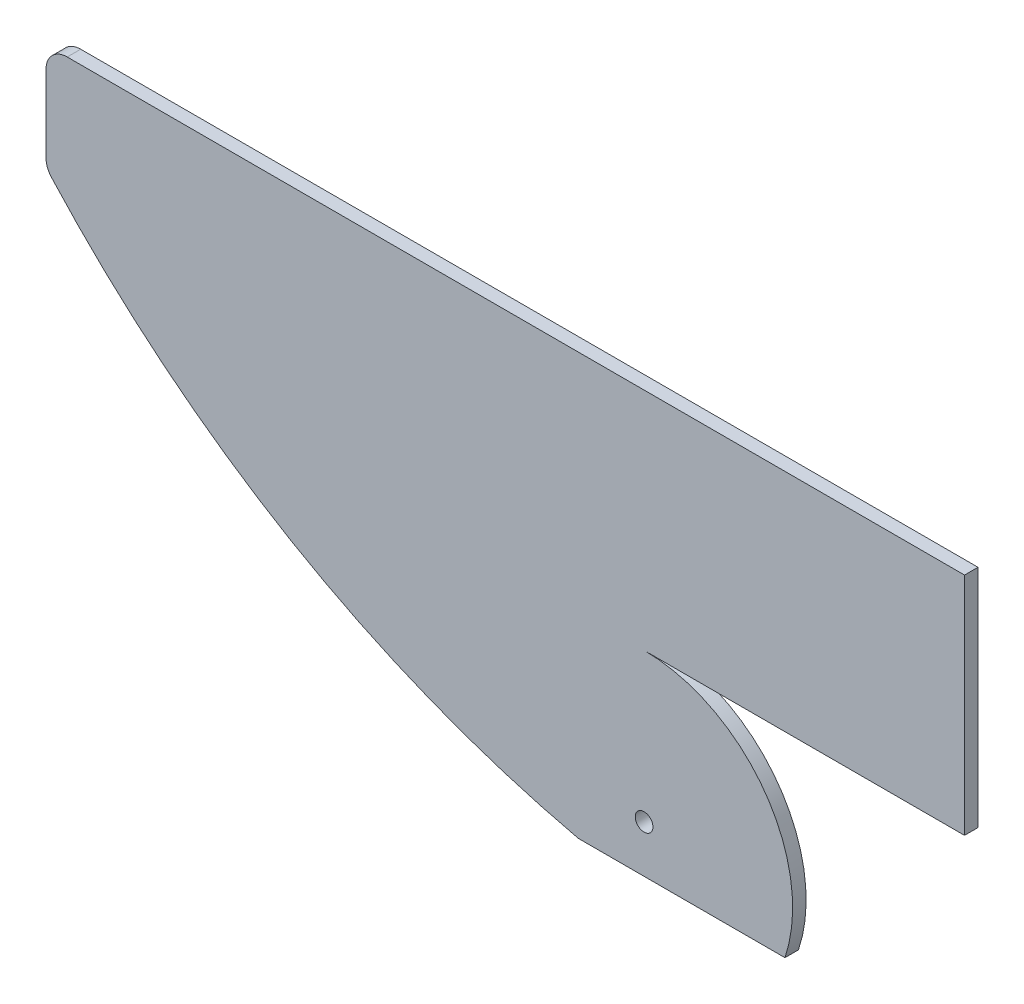
ISO-10303-21;
HEADER;
FILE_DESCRIPTION(('STEP AP214'),'2;1');
FILE_NAME('part.step','',(''),(''),'','','');
FILE_SCHEMA(('AUTOMOTIVE_DESIGN { 1 0 10303 214 1 1 1 1 }'));
ENDSEC;
DATA;
#1=APPLICATION_CONTEXT('core data for automotive mechanical design processes');
#2=APPLICATION_PROTOCOL_DEFINITION('international standard','automotive_design',2000,#1);
#3=PRODUCT_CONTEXT('',#1,'mechanical');
#4=PRODUCT('Part','Part','',(#3));
#5=PRODUCT_RELATED_PRODUCT_CATEGORY('part','',(#4));
#6=PRODUCT_DEFINITION_FORMATION('','',#4);
#7=PRODUCT_DEFINITION_CONTEXT('part definition',#1,'design');
#8=PRODUCT_DEFINITION('design','',#6,#7);
#9=PRODUCT_DEFINITION_SHAPE('','',#8);
#10=(LENGTH_UNIT() NAMED_UNIT(*) SI_UNIT(.MILLI.,.METRE.));
#11=(NAMED_UNIT(*) PLANE_ANGLE_UNIT() SI_UNIT($,.RADIAN.));
#12=(NAMED_UNIT(*) SI_UNIT($,.STERADIAN.) SOLID_ANGLE_UNIT());
#13=UNCERTAINTY_MEASURE_WITH_UNIT(LENGTH_MEASURE(1.E-05),#10,'distance_accuracy_value','');
#14=(GEOMETRIC_REPRESENTATION_CONTEXT(3) GLOBAL_UNCERTAINTY_ASSIGNED_CONTEXT((#13)) GLOBAL_UNIT_ASSIGNED_CONTEXT((#10,
#11,#12)) REPRESENTATION_CONTEXT('',''));
#15=CARTESIAN_POINT('',(0.,0.,0.));
#16=DIRECTION('',(0.,0.,1.));
#17=DIRECTION('',(1.,0.,0.));
#18=AXIS2_PLACEMENT_3D('',#15,#16,#17);
#19=CARTESIAN_POINT('',(0.,-22.225,6.35));
#20=DIRECTION('',(0.,1.,0.));
#21=DIRECTION('',(-1.,0.,0.));
#22=AXIS2_PLACEMENT_3D('',#19,#20,#21);
#23=PLANE('',#22);
#24=DIRECTION('',(0.,0.,1.));
#25=VECTOR('',#24,1.);
#26=CARTESIAN_POINT('',(66.3780790246298,-22.225,0.));
#27=LINE('',#26,#25);
#28=CARTESIAN_POINT('',(66.3780790246298,-22.225,0.));
#29=VERTEX_POINT('',#28);
#30=CARTESIAN_POINT('',(66.3780790246298,-22.225,6.35));
#31=VERTEX_POINT('',#30);
#32=EDGE_CURVE('E146',#29,#31,#27,.T.);
#33=ORIENTED_EDGE('',*,*,#32,.T.);
#34=DIRECTION('',(1.,0.,0.));
#35=VECTOR('',#34,1.);
#36=CARTESIAN_POINT('',(0.,-22.225,6.35));
#37=LINE('',#36,#35);
#38=CARTESIAN_POINT('',(-31.,-22.225,6.35));
#39=VERTEX_POINT('',#38);
#40=EDGE_CURVE('E178',#39,#31,#37,.T.);
#41=ORIENTED_EDGE('',*,*,#40,.F.);
#42=DIRECTION('',(0.,0.,-1.));
#43=VECTOR('',#42,1.);
#44=CARTESIAN_POINT('',(-31.,-22.225,6.35));
#45=LINE('',#44,#43);
#46=CARTESIAN_POINT('',(-31.,-22.225,0.));
#47=VERTEX_POINT('',#46);
#48=EDGE_CURVE('E53',#39,#47,#45,.T.);
#49=ORIENTED_EDGE('',*,*,#48,.T.);
#50=DIRECTION('',(1.,0.,0.));
#51=VECTOR('',#50,1.);
#52=CARTESIAN_POINT('',(0.,-22.225,0.));
#53=LINE('',#52,#51);
#54=EDGE_CURVE('E145',#47,#29,#53,.T.);
#55=ORIENTED_EDGE('',*,*,#54,.T.);
#56=EDGE_LOOP('',(#33,#41,#49,#55));
#57=FACE_BOUND('',#56,.T.);
#58=ADVANCED_FACE('F44',(#57),#23,.F.);
#59=CARTESIAN_POINT('',(76.5230533338092,445.577087427765,6.35));
#60=DIRECTION('',(0.,0.,-1.));
#61=DIRECTION('',(-1.,0.,0.));
#62=AXIS2_PLACEMENT_3D('',#59,#60,#61);
#63=CYLINDRICAL_SURFACE('',#62,480.);
#64=CARTESIAN_POINT('',(76.5230533338092,445.577087427765,0.));
#65=DIRECTION('',(0.,0.,1.));
#66=DIRECTION('',(1.,0.,0.));
#67=AXIS2_PLACEMENT_3D('',#64,#65,#66);
#68=CIRCLE('',#67,480.);
#69=CARTESIAN_POINT('',(-279.25614171058,123.364169664423,0.));
#70=VERTEX_POINT('',#69);
#71=EDGE_CURVE('E142',#47,#70,#68,.F.);
#72=ORIENTED_EDGE('',*,*,#71,.F.);
#73=ORIENTED_EDGE('',*,*,#48,.F.);
#74=CARTESIAN_POINT('',(76.5230533338092,445.577087427765,6.35));
#75=DIRECTION('',(0.,0.,1.));
#76=DIRECTION('',(1.,0.,0.));
#77=AXIS2_PLACEMENT_3D('',#74,#75,#76);
#78=CIRCLE('',#77,480.);
#79=CARTESIAN_POINT('',(-279.25614171058,123.364169664423,6.35));
#80=VERTEX_POINT('',#79);
#81=EDGE_CURVE('E167',#39,#80,#78,.F.);
#82=ORIENTED_EDGE('',*,*,#81,.T.);
#83=DIRECTION('',(0.,0.,-1.));
#84=VECTOR('',#83,1.);
#85=CARTESIAN_POINT('',(-279.25614171058,123.364169664423,6.35));
#86=LINE('',#85,#84);
#87=EDGE_CURVE('E68',#80,#70,#86,.T.);
#88=ORIENTED_EDGE('',*,*,#87,.T.);
#89=EDGE_LOOP('',(#72,#73,#82,#88));
#90=FACE_BOUND('',#89,.T.);
#91=ADVANCED_FACE('F46',(#90),#63,.T.);
#92=CARTESIAN_POINT('',(0.,176.244969994664,6.35));
#93=DIRECTION('',(0.,1.,0.));
#94=DIRECTION('',(0.,0.,1.));
#95=AXIS2_PLACEMENT_3D('',#92,#93,#94);
#96=PLANE('',#95);
#97=DIRECTION('',(0.,0.,1.));
#98=VECTOR('',#97,1.);
#99=CARTESIAN_POINT('',(151.,176.244969994664,0.));
#100=LINE('',#99,#98);
#101=CARTESIAN_POINT('',(151.,176.244969994664,0.));
#102=VERTEX_POINT('',#101);
#103=CARTESIAN_POINT('',(151.,176.244969994664,6.35));
#104=VERTEX_POINT('',#103);
#105=EDGE_CURVE('E244',#102,#104,#100,.T.);
#106=ORIENTED_EDGE('',*,*,#105,.F.);
#107=DIRECTION('',(1.,0.,0.));
#108=VECTOR('',#107,1.);
#109=CARTESIAN_POINT('',(0.,176.244969994664,0.));
#110=LINE('',#109,#108);
#111=CARTESIAN_POINT('',(-271.844075147155,176.244969994664,0.));
#112=VERTEX_POINT('',#111);
#113=EDGE_CURVE('E150',#112,#102,#110,.T.);
#114=ORIENTED_EDGE('',*,*,#113,.F.);
#115=DIRECTION('',(0.,0.,-1.));
#116=VECTOR('',#115,1.);
#117=CARTESIAN_POINT('',(-271.844075147155,176.244969994664,6.35));
#118=LINE('',#117,#116);
#119=CARTESIAN_POINT('',(-271.844075147155,176.244969994664,6.35));
#120=VERTEX_POINT('',#119);
#121=EDGE_CURVE('E116',#120,#112,#118,.T.);
#122=ORIENTED_EDGE('',*,*,#121,.F.);
#123=DIRECTION('',(1.,0.,0.));
#124=VECTOR('',#123,1.);
#125=CARTESIAN_POINT('',(0.,176.244969994664,6.35));
#126=LINE('',#125,#124);
#127=EDGE_CURVE('E127',#120,#104,#126,.T.);
#128=ORIENTED_EDGE('',*,*,#127,.T.);
#129=EDGE_LOOP('',(#106,#114,#122,#128));
#130=FACE_BOUND('',#129,.T.);
#131=ADVANCED_FACE('F188',(#130),#96,.T.);
#132=CARTESIAN_POINT('',(-271.844075147155,166.244969994664,6.35));
#133=DIRECTION('',(0.,0.,-1.));
#134=DIRECTION('',(-1.,0.,0.));
#135=AXIS2_PLACEMENT_3D('',#132,#133,#134);
#136=CYLINDRICAL_SURFACE('',#135,10.);
#137=CARTESIAN_POINT('',(-271.844075147155,166.244969994664,0.));
#138=DIRECTION('',(0.,0.,1.));
#139=DIRECTION('',(1.,0.,0.));
#140=AXIS2_PLACEMENT_3D('',#137,#138,#139);
#141=CIRCLE('',#140,10.);
#142=CARTESIAN_POINT('',(-281.844075147155,166.244969994664,0.));
#143=VERTEX_POINT('',#142);
#144=EDGE_CURVE('E110',#143,#112,#141,.F.);
#145=ORIENTED_EDGE('',*,*,#144,.F.);
#146=DIRECTION('',(0.,0.,-1.));
#147=VECTOR('',#146,1.);
#148=CARTESIAN_POINT('',(-281.844075147155,166.244969994664,6.35));
#149=LINE('',#148,#147);
#150=CARTESIAN_POINT('',(-281.844075147155,166.244969994664,6.35));
#151=VERTEX_POINT('',#150);
#152=EDGE_CURVE('E105',#151,#143,#149,.T.);
#153=ORIENTED_EDGE('',*,*,#152,.F.);
#154=CARTESIAN_POINT('',(-271.844075147155,166.244969994664,6.35));
#155=DIRECTION('',(0.,0.,1.));
#156=DIRECTION('',(1.,0.,0.));
#157=AXIS2_PLACEMENT_3D('',#154,#155,#156);
#158=CIRCLE('',#157,10.);
#159=EDGE_CURVE('E108',#151,#120,#158,.F.);
#160=ORIENTED_EDGE('',*,*,#159,.T.);
#161=ORIENTED_EDGE('',*,*,#121,.T.);
#162=EDGE_LOOP('',(#145,#153,#160,#161));
#163=FACE_BOUND('',#162,.T.);
#164=ADVANCED_FACE('F107',(#163),#136,.T.);
#165=CARTESIAN_POINT('',(-281.844075147155,0.,6.35));
#166=DIRECTION('',(-1.,0.,0.));
#167=DIRECTION('',(0.,0.,1.));
#168=AXIS2_PLACEMENT_3D('',#165,#166,#167);
#169=PLANE('',#168);
#170=DIRECTION('',(0.,1.,0.));
#171=VECTOR('',#170,1.);
#172=CARTESIAN_POINT('',(-281.844075147155,0.,0.));
#173=LINE('',#172,#171);
#174=CARTESIAN_POINT('',(-281.844075147155,130.076938784492,0.));
#175=VERTEX_POINT('',#174);
#176=EDGE_CURVE('E156',#175,#143,#173,.T.);
#177=ORIENTED_EDGE('',*,*,#176,.F.);
#178=DIRECTION('',(0.,0.,-1.));
#179=VECTOR('',#178,1.);
#180=CARTESIAN_POINT('',(-281.844075147155,130.076938784492,6.35));
#181=LINE('',#180,#179);
#182=CARTESIAN_POINT('',(-281.844075147155,130.076938784492,6.35));
#183=VERTEX_POINT('',#182);
#184=EDGE_CURVE('E117',#183,#175,#181,.T.);
#185=ORIENTED_EDGE('',*,*,#184,.F.);
#186=DIRECTION('',(0.,1.,0.));
#187=VECTOR('',#186,1.);
#188=CARTESIAN_POINT('',(-281.844075147155,0.,6.35));
#189=LINE('',#188,#187);
#190=EDGE_CURVE('E125',#183,#151,#189,.T.);
#191=ORIENTED_EDGE('',*,*,#190,.T.);
#192=ORIENTED_EDGE('',*,*,#152,.T.);
#193=EDGE_LOOP('',(#177,#185,#191,#192));
#194=FACE_BOUND('',#193,.T.);
#195=ADVANCED_FACE('F130',(#194),#169,.T.);
#196=CARTESIAN_POINT('',(-271.844075147155,130.076938784492,6.35));
#197=DIRECTION('',(0.,0.,-1.));
#198=DIRECTION('',(-1.,0.,0.));
#199=AXIS2_PLACEMENT_3D('',#196,#197,#198);
#200=CYLINDRICAL_SURFACE('',#199,10.);
#201=CARTESIAN_POINT('',(-271.844075147155,130.076938784492,0.));
#202=DIRECTION('',(0.,0.,1.));
#203=DIRECTION('',(1.,0.,0.));
#204=AXIS2_PLACEMENT_3D('',#201,#202,#203);
#205=CIRCLE('',#204,10.);
#206=EDGE_CURVE('E159',#70,#175,#205,.F.);
#207=ORIENTED_EDGE('',*,*,#206,.F.);
#208=ORIENTED_EDGE('',*,*,#87,.F.);
#209=CARTESIAN_POINT('',(-271.844075147155,130.076938784492,6.35));
#210=DIRECTION('',(0.,0.,1.));
#211=DIRECTION('',(1.,0.,0.));
#212=AXIS2_PLACEMENT_3D('',#209,#210,#211);
#213=CIRCLE('',#212,10.);
#214=EDGE_CURVE('E132',#80,#183,#213,.F.);
#215=ORIENTED_EDGE('',*,*,#214,.T.);
#216=ORIENTED_EDGE('',*,*,#184,.T.);
#217=EDGE_LOOP('',(#207,#208,#215,#216));
#218=FACE_BOUND('',#217,.T.);
#219=ADVANCED_FACE('F205',(#218),#200,.T.);
#220=CARTESIAN_POINT('',(0.,0.,6.35));
#221=DIRECTION('',(0.,0.,-1.));
#222=DIRECTION('',(-1.,0.,0.));
#223=AXIS2_PLACEMENT_3D('',#220,#221,#222);
#224=CYLINDRICAL_SURFACE('',#223,4.16899330892724);
#225=CARTESIAN_POINT('',(0.,0.,6.35));
#226=DIRECTION('',(0.,0.,1.));
#227=DIRECTION('',(1.,0.,0.));
#228=AXIS2_PLACEMENT_3D('',#225,#226,#227);
#229=CIRCLE('',#228,4.16899330892724);
#230=CARTESIAN_POINT('',(4.16899330892725,0.,6.35));
#231=VERTEX_POINT('',#230);
#232=EDGE_CURVE('E135',#231,#231,#229,.T.);
#233=ORIENTED_EDGE('',*,*,#232,.T.);
#234=EDGE_LOOP('',(#233));
#235=FACE_BOUND('',#234,.T.);
#236=CARTESIAN_POINT('',(0.,0.,0.));
#237=DIRECTION('',(0.,0.,1.));
#238=DIRECTION('',(1.,0.,0.));
#239=AXIS2_PLACEMENT_3D('',#236,#237,#238);
#240=CIRCLE('',#239,4.16899330892724);
#241=CARTESIAN_POINT('',(4.16899330892725,0.,0.));
#242=VERTEX_POINT('',#241);
#243=EDGE_CURVE('E163',#242,#242,#240,.T.);
#244=ORIENTED_EDGE('',*,*,#243,.F.);
#245=EDGE_LOOP('',(#244));
#246=FACE_BOUND('',#245,.T.);
#247=ADVANCED_FACE('F208',(#235,#246),#224,.F.);
#248=CARTESIAN_POINT('',(0.,0.,6.35));
#249=DIRECTION('',(0.,0.,1.));
#250=DIRECTION('',(1.,0.,0.));
#251=AXIS2_PLACEMENT_3D('',#248,#249,#250);
#252=PLANE('',#251);
#253=DIRECTION('',(0.,-1.,0.));
#254=VECTOR('',#253,1.);
#255=CARTESIAN_POINT('',(151.,176.244969994664,6.35));
#256=LINE('',#255,#254);
#257=CARTESIAN_POINT('',(151.,70.,6.35));
#258=VERTEX_POINT('',#257);
#259=EDGE_CURVE('E59',#104,#258,#256,.T.);
#260=ORIENTED_EDGE('',*,*,#259,.F.);
#261=ORIENTED_EDGE('',*,*,#127,.F.);
#262=ORIENTED_EDGE('',*,*,#159,.F.);
#263=ORIENTED_EDGE('',*,*,#190,.F.);
#264=ORIENTED_EDGE('',*,*,#214,.F.);
#265=ORIENTED_EDGE('',*,*,#81,.F.);
#266=ORIENTED_EDGE('',*,*,#40,.T.);
#267=CARTESIAN_POINT('',(0.,0.,6.35));
#268=DIRECTION('',(0.,0.,1.));
#269=DIRECTION('',(1.,0.,0.));
#270=AXIS2_PLACEMENT_3D('',#267,#268,#269);
#271=CIRCLE('',#270,70.);
#272=CARTESIAN_POINT('',(0.,70.,6.35));
#273=VERTEX_POINT('',#272);
#274=EDGE_CURVE('E250',#31,#273,#271,.T.);
#275=ORIENTED_EDGE('',*,*,#274,.T.);
#276=DIRECTION('',(1.,0.,0.));
#277=VECTOR('',#276,1.);
#278=CARTESIAN_POINT('',(0.,70.,6.35));
#279=LINE('',#278,#277);
#280=EDGE_CURVE('E256',#273,#258,#279,.T.);
#281=ORIENTED_EDGE('',*,*,#280,.T.);
#282=EDGE_LOOP('',(#260,#261,#262,#263,#264,#265,#266,#275,#281));
#283=FACE_BOUND('',#282,.T.);
#284=ORIENTED_EDGE('',*,*,#232,.F.);
#285=EDGE_LOOP('',(#284));
#286=FACE_BOUND('',#285,.T.);
#287=ADVANCED_FACE('F122',(#283,#286),#252,.T.);
#288=CARTESIAN_POINT('',(0.,0.,0.));
#289=DIRECTION('',(0.,0.,1.));
#290=DIRECTION('',(1.,0.,0.));
#291=AXIS2_PLACEMENT_3D('',#288,#289,#290);
#292=PLANE('',#291);
#293=ORIENTED_EDGE('',*,*,#113,.T.);
#294=DIRECTION('',(0.,-1.,0.));
#295=VECTOR('',#294,1.);
#296=CARTESIAN_POINT('',(151.,176.244969994664,0.));
#297=LINE('',#296,#295);
#298=CARTESIAN_POINT('',(151.,70.,0.));
#299=VERTEX_POINT('',#298);
#300=EDGE_CURVE('E233',#102,#299,#297,.T.);
#301=ORIENTED_EDGE('',*,*,#300,.T.);
#302=DIRECTION('',(1.,0.,0.));
#303=VECTOR('',#302,1.);
#304=CARTESIAN_POINT('',(0.,70.,0.));
#305=LINE('',#304,#303);
#306=CARTESIAN_POINT('',(0.,70.,0.));
#307=VERTEX_POINT('',#306);
#308=EDGE_CURVE('E241',#307,#299,#305,.T.);
#309=ORIENTED_EDGE('',*,*,#308,.F.);
#310=CARTESIAN_POINT('',(0.,0.,0.));
#311=DIRECTION('',(0.,0.,1.));
#312=DIRECTION('',(1.,0.,0.));
#313=AXIS2_PLACEMENT_3D('',#310,#311,#312);
#314=CIRCLE('',#313,70.);
#315=EDGE_CURVE('E186',#29,#307,#314,.T.);
#316=ORIENTED_EDGE('',*,*,#315,.F.);
#317=ORIENTED_EDGE('',*,*,#54,.F.);
#318=ORIENTED_EDGE('',*,*,#71,.T.);
#319=ORIENTED_EDGE('',*,*,#206,.T.);
#320=ORIENTED_EDGE('',*,*,#176,.T.);
#321=ORIENTED_EDGE('',*,*,#144,.T.);
#322=EDGE_LOOP('',(#293,#301,#309,#316,#317,#318,#319,#320,#321));
#323=FACE_BOUND('',#322,.T.);
#324=ORIENTED_EDGE('',*,*,#243,.T.);
#325=EDGE_LOOP('',(#324));
#326=FACE_BOUND('',#325,.T.);
#327=ADVANCED_FACE('F182',(#323,#326),#292,.F.);
#328=CARTESIAN_POINT('',(0.,0.,0.));
#329=DIRECTION('',(0.,0.,1.));
#330=DIRECTION('',(1.,0.,0.));
#331=AXIS2_PLACEMENT_3D('',#328,#329,#330);
#332=CYLINDRICAL_SURFACE('',#331,70.);
#333=ORIENTED_EDGE('',*,*,#274,.F.);
#334=ORIENTED_EDGE('',*,*,#32,.F.);
#335=ORIENTED_EDGE('',*,*,#315,.T.);
#336=DIRECTION('',(0.,0.,1.));
#337=VECTOR('',#336,1.);
#338=CARTESIAN_POINT('',(0.,70.,0.));
#339=LINE('',#338,#337);
#340=EDGE_CURVE('E248',#307,#273,#339,.T.);
#341=ORIENTED_EDGE('',*,*,#340,.T.);
#342=EDGE_LOOP('',(#333,#334,#335,#341));
#343=FACE_BOUND('',#342,.T.);
#344=ADVANCED_FACE('F214',(#343),#332,.T.);
#345=CARTESIAN_POINT('',(0.,70.,0.));
#346=DIRECTION('',(0.,-1.,0.));
#347=DIRECTION('',(1.,0.,0.));
#348=AXIS2_PLACEMENT_3D('',#345,#346,#347);
#349=PLANE('',#348);
#350=DIRECTION('',(0.,0.,-1.));
#351=VECTOR('',#350,1.);
#352=CARTESIAN_POINT('',(151.,70.,0.));
#353=LINE('',#352,#351);
#354=EDGE_CURVE('E11',#258,#299,#353,.T.);
#355=ORIENTED_EDGE('',*,*,#354,.F.);
#356=ORIENTED_EDGE('',*,*,#280,.F.);
#357=ORIENTED_EDGE('',*,*,#340,.F.);
#358=ORIENTED_EDGE('',*,*,#308,.T.);
#359=EDGE_LOOP('',(#355,#356,#357,#358));
#360=FACE_BOUND('',#359,.T.);
#361=ADVANCED_FACE('F217',(#360),#349,.T.);
#362=CARTESIAN_POINT('',(151.,176.244969994664,0.));
#363=DIRECTION('',(-1.,0.,0.));
#364=DIRECTION('',(0.,0.,1.));
#365=AXIS2_PLACEMENT_3D('',#362,#363,#364);
#366=PLANE('',#365);
#367=ORIENTED_EDGE('',*,*,#354,.T.);
#368=ORIENTED_EDGE('',*,*,#300,.F.);
#369=ORIENTED_EDGE('',*,*,#105,.T.);
#370=ORIENTED_EDGE('',*,*,#259,.T.);
#371=EDGE_LOOP('',(#367,#368,#369,#370));
#372=FACE_BOUND('',#371,.T.);
#373=ADVANCED_FACE('F220',(#372),#366,.F.);
#374=CLOSED_SHELL('',(#58,#91,#131,#164,#195,#219,#247,#287,#327,#344,#361,#373));
#375=MANIFOLD_SOLID_BREP('B2',#374);
#376=ADVANCED_BREP_SHAPE_REPRESENTATION('',(#18,#375),#14);
#377=SHAPE_DEFINITION_REPRESENTATION(#9,#376);
ENDSEC;
END-ISO-10303-21;
